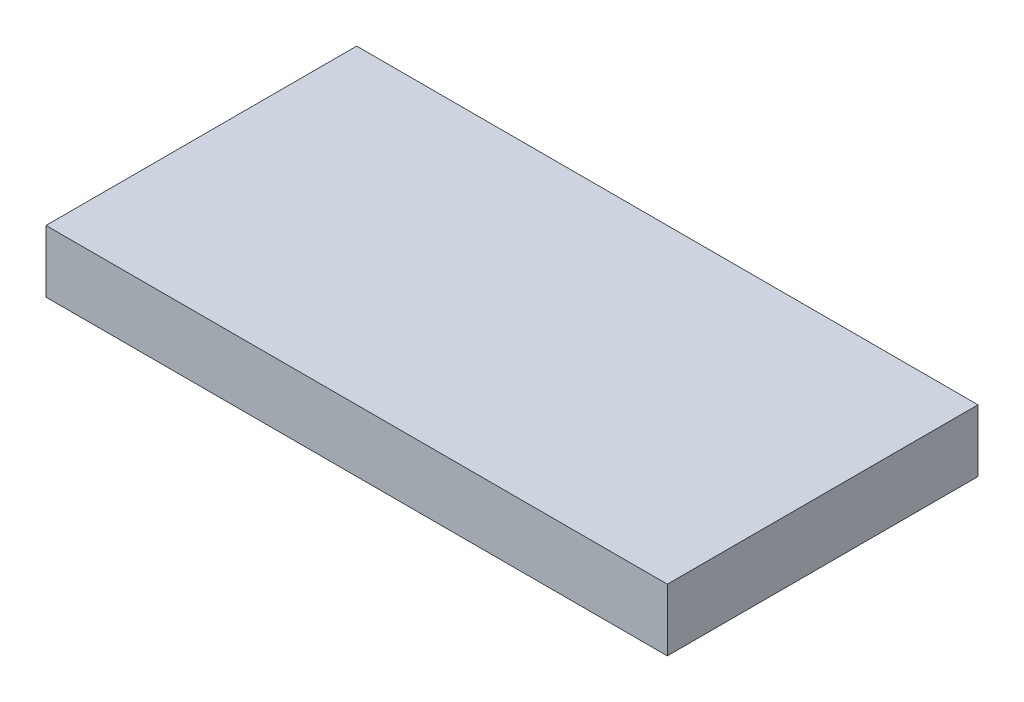
ISO-10303-21;
HEADER;
FILE_DESCRIPTION(('STEP AP214'),'2;1');
FILE_NAME('part.step','',(''),(''),'','','');
FILE_SCHEMA(('AUTOMOTIVE_DESIGN { 1 0 10303 214 1 1 1 1 }'));
ENDSEC;
DATA;
#1=APPLICATION_CONTEXT('core data for automotive mechanical design processes');
#2=APPLICATION_PROTOCOL_DEFINITION('international standard','automotive_design',2000,#1);
#3=PRODUCT_CONTEXT('',#1,'mechanical');
#4=PRODUCT('Part','Part','',(#3));
#5=PRODUCT_RELATED_PRODUCT_CATEGORY('part','',(#4));
#6=PRODUCT_DEFINITION_FORMATION('','',#4);
#7=PRODUCT_DEFINITION_CONTEXT('part definition',#1,'design');
#8=PRODUCT_DEFINITION('design','',#6,#7);
#9=PRODUCT_DEFINITION_SHAPE('','',#8);
#10=(LENGTH_UNIT() NAMED_UNIT(*) SI_UNIT(.MILLI.,.METRE.));
#11=(NAMED_UNIT(*) PLANE_ANGLE_UNIT() SI_UNIT($,.RADIAN.));
#12=(NAMED_UNIT(*) SI_UNIT($,.STERADIAN.) SOLID_ANGLE_UNIT());
#13=UNCERTAINTY_MEASURE_WITH_UNIT(LENGTH_MEASURE(1.E-05),#10,'distance_accuracy_value','');
#14=(GEOMETRIC_REPRESENTATION_CONTEXT(3) GLOBAL_UNCERTAINTY_ASSIGNED_CONTEXT((#13)) GLOBAL_UNIT_ASSIGNED_CONTEXT((#10,
#11,#12)) REPRESENTATION_CONTEXT('',''));
#15=CARTESIAN_POINT('',(0.,0.,0.));
#16=DIRECTION('',(0.,0.,1.));
#17=DIRECTION('',(1.,0.,0.));
#18=AXIS2_PLACEMENT_3D('',#15,#16,#17);
#19=CARTESIAN_POINT('',(15.,3.,7.5));
#20=DIRECTION('',(-1.,0.,0.));
#21=DIRECTION('',(0.,0.,1.));
#22=AXIS2_PLACEMENT_3D('',#19,#20,#21);
#23=PLANE('',#22);
#24=DIRECTION('',(0.,0.,-1.));
#25=VECTOR('',#24,1.);
#26=CARTESIAN_POINT('',(15.,0.,7.5));
#27=LINE('',#26,#25);
#28=CARTESIAN_POINT('',(15.,0.,7.5));
#29=VERTEX_POINT('',#28);
#30=CARTESIAN_POINT('',(15.,0.,-7.5));
#31=VERTEX_POINT('',#30);
#32=EDGE_CURVE('E96',#29,#31,#27,.T.);
#33=ORIENTED_EDGE('',*,*,#32,.T.);
#34=DIRECTION('',(0.,-1.,0.));
#35=VECTOR('',#34,1.);
#36=CARTESIAN_POINT('',(15.,3.,-7.5));
#37=LINE('',#36,#35);
#38=CARTESIAN_POINT('',(15.,3.,-7.5));
#39=VERTEX_POINT('',#38);
#40=EDGE_CURVE('E11',#39,#31,#37,.T.);
#41=ORIENTED_EDGE('',*,*,#40,.F.);
#42=DIRECTION('',(0.,0.,-1.));
#43=VECTOR('',#42,1.);
#44=CARTESIAN_POINT('',(15.,3.,7.5));
#45=LINE('',#44,#43);
#46=CARTESIAN_POINT('',(15.,3.,7.5));
#47=VERTEX_POINT('',#46);
#48=EDGE_CURVE('E84',#47,#39,#45,.T.);
#49=ORIENTED_EDGE('',*,*,#48,.F.);
#50=DIRECTION('',(0.,-1.,0.));
#51=VECTOR('',#50,1.);
#52=CARTESIAN_POINT('',(15.,3.,7.5));
#53=LINE('',#52,#51);
#54=EDGE_CURVE('E92',#47,#29,#53,.T.);
#55=ORIENTED_EDGE('',*,*,#54,.T.);
#56=EDGE_LOOP('',(#33,#41,#49,#55));
#57=FACE_BOUND('',#56,.T.);
#58=ADVANCED_FACE('F33',(#57),#23,.F.);
#59=CARTESIAN_POINT('',(-15.,3.,-7.5));
#60=DIRECTION('',(0.,0.,1.));
#61=DIRECTION('',(1.,0.,0.));
#62=AXIS2_PLACEMENT_3D('',#59,#60,#61);
#63=PLANE('',#62);
#64=DIRECTION('',(-1.,0.,0.));
#65=VECTOR('',#64,1.);
#66=CARTESIAN_POINT('',(-15.,0.,-7.5));
#67=LINE('',#66,#65);
#68=CARTESIAN_POINT('',(-15.,0.,-7.5));
#69=VERTEX_POINT('',#68);
#70=EDGE_CURVE('E88',#31,#69,#67,.T.);
#71=ORIENTED_EDGE('',*,*,#70,.T.);
#72=DIRECTION('',(0.,-1.,0.));
#73=VECTOR('',#72,1.);
#74=CARTESIAN_POINT('',(-15.,3.,-7.5));
#75=LINE('',#74,#73);
#76=CARTESIAN_POINT('',(-15.,3.,-7.5));
#77=VERTEX_POINT('',#76);
#78=EDGE_CURVE('E41',#77,#69,#75,.T.);
#79=ORIENTED_EDGE('',*,*,#78,.F.);
#80=DIRECTION('',(-1.,0.,0.));
#81=VECTOR('',#80,1.);
#82=CARTESIAN_POINT('',(-15.,3.,-7.5));
#83=LINE('',#82,#81);
#84=EDGE_CURVE('E79',#39,#77,#83,.T.);
#85=ORIENTED_EDGE('',*,*,#84,.F.);
#86=ORIENTED_EDGE('',*,*,#40,.T.);
#87=EDGE_LOOP('',(#71,#79,#85,#86));
#88=FACE_BOUND('',#87,.T.);
#89=ADVANCED_FACE('F87',(#88),#63,.F.);
#90=CARTESIAN_POINT('',(-15.,3.,7.5));
#91=DIRECTION('',(1.,0.,0.));
#92=DIRECTION('',(0.,0.,-1.));
#93=AXIS2_PLACEMENT_3D('',#90,#91,#92);
#94=PLANE('',#93);
#95=DIRECTION('',(0.,0.,1.));
#96=VECTOR('',#95,1.);
#97=CARTESIAN_POINT('',(-15.,0.,7.5));
#98=LINE('',#97,#96);
#99=CARTESIAN_POINT('',(-15.,0.,7.5));
#100=VERTEX_POINT('',#99);
#101=EDGE_CURVE('E66',#69,#100,#98,.T.);
#102=ORIENTED_EDGE('',*,*,#101,.T.);
#103=DIRECTION('',(0.,-1.,0.));
#104=VECTOR('',#103,1.);
#105=CARTESIAN_POINT('',(-15.,3.,7.5));
#106=LINE('',#105,#104);
#107=CARTESIAN_POINT('',(-15.,3.,7.5));
#108=VERTEX_POINT('',#107);
#109=EDGE_CURVE('E89',#108,#100,#106,.T.);
#110=ORIENTED_EDGE('',*,*,#109,.F.);
#111=DIRECTION('',(0.,0.,1.));
#112=VECTOR('',#111,1.);
#113=CARTESIAN_POINT('',(-15.,3.,7.5));
#114=LINE('',#113,#112);
#115=EDGE_CURVE('E82',#77,#108,#114,.T.);
#116=ORIENTED_EDGE('',*,*,#115,.F.);
#117=ORIENTED_EDGE('',*,*,#78,.T.);
#118=EDGE_LOOP('',(#102,#110,#116,#117));
#119=FACE_BOUND('',#118,.T.);
#120=ADVANCED_FACE('F90',(#119),#94,.F.);
#121=CARTESIAN_POINT('',(-15.,3.,7.5));
#122=DIRECTION('',(0.,0.,-1.));
#123=DIRECTION('',(-1.,0.,0.));
#124=AXIS2_PLACEMENT_3D('',#121,#122,#123);
#125=PLANE('',#124);
#126=DIRECTION('',(1.,0.,0.));
#127=VECTOR('',#126,1.);
#128=CARTESIAN_POINT('',(-15.,0.,7.5));
#129=LINE('',#128,#127);
#130=EDGE_CURVE('E72',#100,#29,#129,.T.);
#131=ORIENTED_EDGE('',*,*,#130,.T.);
#132=ORIENTED_EDGE('',*,*,#54,.F.);
#133=DIRECTION('',(1.,0.,0.));
#134=VECTOR('',#133,1.);
#135=CARTESIAN_POINT('',(-15.,3.,7.5));
#136=LINE('',#135,#134);
#137=EDGE_CURVE('E49',#108,#47,#136,.T.);
#138=ORIENTED_EDGE('',*,*,#137,.F.);
#139=ORIENTED_EDGE('',*,*,#109,.T.);
#140=EDGE_LOOP('',(#131,#132,#138,#139));
#141=FACE_BOUND('',#140,.T.);
#142=ADVANCED_FACE('F103',(#141),#125,.F.);
#143=CARTESIAN_POINT('',(0.,3.,0.));
#144=DIRECTION('',(0.,-1.,0.));
#145=DIRECTION('',(0.,0.,-1.));
#146=AXIS2_PLACEMENT_3D('',#143,#144,#145);
#147=PLANE('',#146);
#148=ORIENTED_EDGE('',*,*,#48,.T.);
#149=ORIENTED_EDGE('',*,*,#84,.T.);
#150=ORIENTED_EDGE('',*,*,#115,.T.);
#151=ORIENTED_EDGE('',*,*,#137,.T.);
#152=EDGE_LOOP('',(#148,#149,#150,#151));
#153=FACE_BOUND('',#152,.T.);
#154=ADVANCED_FACE('F80',(#153),#147,.F.);
#155=CARTESIAN_POINT('',(0.,0.,0.));
#156=DIRECTION('',(0.,-1.,0.));
#157=DIRECTION('',(0.,0.,-1.));
#158=AXIS2_PLACEMENT_3D('',#155,#156,#157);
#159=PLANE('',#158);
#160=ORIENTED_EDGE('',*,*,#32,.F.);
#161=ORIENTED_EDGE('',*,*,#130,.F.);
#162=ORIENTED_EDGE('',*,*,#101,.F.);
#163=ORIENTED_EDGE('',*,*,#70,.F.);
#164=EDGE_LOOP('',(#160,#161,#162,#163));
#165=FACE_BOUND('',#164,.T.);
#166=ADVANCED_FACE('F106',(#165),#159,.T.);
#167=CLOSED_SHELL('',(#58,#89,#120,#142,#154,#166));
#168=MANIFOLD_SOLID_BREP('B2',#167);
#169=ADVANCED_BREP_SHAPE_REPRESENTATION('',(#18,#168),#14);
#170=SHAPE_DEFINITION_REPRESENTATION(#9,#169);
ENDSEC;
END-ISO-10303-21;
